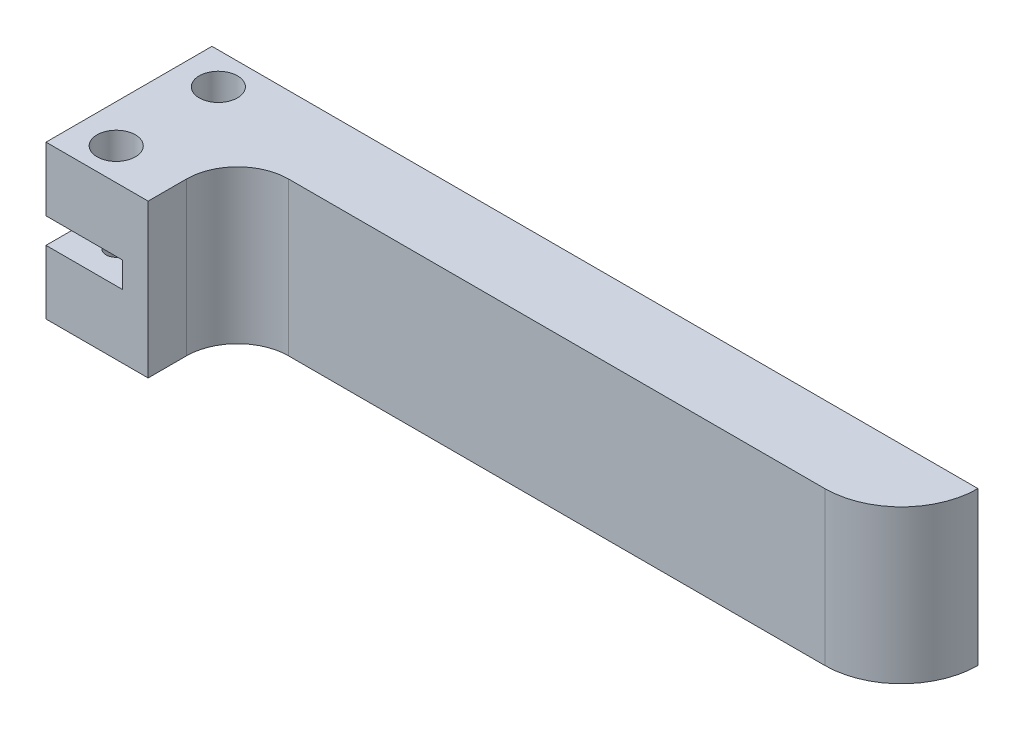
ISO-10303-21;
HEADER;
FILE_DESCRIPTION(('STEP AP214'),'2;1');
FILE_NAME('part.step','',(''),(''),'','','');
FILE_SCHEMA(('AUTOMOTIVE_DESIGN { 1 0 10303 214 1 1 1 1 }'));
ENDSEC;
DATA;
#1=APPLICATION_CONTEXT('core data for automotive mechanical design processes');
#2=APPLICATION_PROTOCOL_DEFINITION('international standard','automotive_design',2000,#1);
#3=PRODUCT_CONTEXT('',#1,'mechanical');
#4=PRODUCT('Part','Part','',(#3));
#5=PRODUCT_RELATED_PRODUCT_CATEGORY('part','',(#4));
#6=PRODUCT_DEFINITION_FORMATION('','',#4);
#7=PRODUCT_DEFINITION_CONTEXT('part definition',#1,'design');
#8=PRODUCT_DEFINITION('design','',#6,#7);
#9=PRODUCT_DEFINITION_SHAPE('','',#8);
#10=(LENGTH_UNIT() NAMED_UNIT(*) SI_UNIT(.MILLI.,.METRE.));
#11=(NAMED_UNIT(*) PLANE_ANGLE_UNIT() SI_UNIT($,.RADIAN.));
#12=(NAMED_UNIT(*) SI_UNIT($,.STERADIAN.) SOLID_ANGLE_UNIT());
#13=UNCERTAINTY_MEASURE_WITH_UNIT(LENGTH_MEASURE(1.E-05),#10,'distance_accuracy_value','');
#14=(GEOMETRIC_REPRESENTATION_CONTEXT(3) GLOBAL_UNCERTAINTY_ASSIGNED_CONTEXT((#13)) GLOBAL_UNIT_ASSIGNED_CONTEXT((#10,
#11,#12)) REPRESENTATION_CONTEXT('',''));
#15=CARTESIAN_POINT('',(0.,0.,0.));
#16=DIRECTION('',(0.,0.,1.));
#17=DIRECTION('',(1.,0.,0.));
#18=AXIS2_PLACEMENT_3D('',#15,#16,#17);
#19=CARTESIAN_POINT('',(-20.,6.,6.5));
#20=DIRECTION('',(1.,0.,0.));
#21=DIRECTION('',(0.,0.,-1.));
#22=AXIS2_PLACEMENT_3D('',#19,#20,#21);
#23=PLANE('',#22);
#24=DIRECTION('',(0.,-1.,0.));
#25=VECTOR('',#24,1.);
#26=CARTESIAN_POINT('',(-20.,6.,-6.5));
#27=LINE('',#26,#25);
#28=CARTESIAN_POINT('',(-20.,9.,-6.5));
#29=VERTEX_POINT('',#28);
#30=CARTESIAN_POINT('',(-20.,4.,-6.5));
#31=VERTEX_POINT('',#30);
#32=EDGE_CURVE('E130',#29,#31,#27,.T.);
#33=ORIENTED_EDGE('',*,*,#32,.T.);
#34=DIRECTION('',(0.,0.,1.));
#35=VECTOR('',#34,1.);
#36=CARTESIAN_POINT('',(-20.,4.,-6.5));
#37=LINE('',#36,#35);
#38=CARTESIAN_POINT('',(-20.,4.,6.5));
#39=VERTEX_POINT('',#38);
#40=EDGE_CURVE('E57',#31,#39,#37,.T.);
#41=ORIENTED_EDGE('',*,*,#40,.T.);
#42=DIRECTION('',(0.,-1.,0.));
#43=VECTOR('',#42,1.);
#44=CARTESIAN_POINT('',(-20.,6.,6.5));
#45=LINE('',#44,#43);
#46=CARTESIAN_POINT('',(-20.,9.,6.5));
#47=VERTEX_POINT('',#46);
#48=EDGE_CURVE('E226',#47,#39,#45,.T.);
#49=ORIENTED_EDGE('',*,*,#48,.F.);
#50=DIRECTION('',(0.,0.,1.));
#51=VECTOR('',#50,1.);
#52=CARTESIAN_POINT('',(-20.,9.,-6.5));
#53=LINE('',#52,#51);
#54=EDGE_CURVE('E183',#29,#47,#53,.T.);
#55=ORIENTED_EDGE('',*,*,#54,.F.);
#56=EDGE_LOOP('',(#33,#41,#49,#55));
#57=FACE_BOUND('',#56,.T.);
#58=ADVANCED_FACE('F33',(#57),#23,.F.);
#59=CARTESIAN_POINT('',(-20.,2.,6.5));
#60=VERTEX_POINT('',#59);
#61=CARTESIAN_POINT('',(-20.,-3.,6.5));
#62=VERTEX_POINT('',#61);
#63=EDGE_CURVE('E225',#60,#62,#45,.T.);
#64=ORIENTED_EDGE('',*,*,#63,.F.);
#65=DIRECTION('',(0.,0.,1.));
#66=VECTOR('',#65,1.);
#67=CARTESIAN_POINT('',(-20.,2.,-6.5));
#68=LINE('',#67,#66);
#69=CARTESIAN_POINT('',(-20.,2.,-6.5));
#70=VERTEX_POINT('',#69);
#71=EDGE_CURVE('E128',#70,#60,#68,.T.);
#72=ORIENTED_EDGE('',*,*,#71,.F.);
#73=CARTESIAN_POINT('',(-20.,-3.,-6.5));
#74=VERTEX_POINT('',#73);
#75=EDGE_CURVE('E122',#70,#74,#27,.T.);
#76=ORIENTED_EDGE('',*,*,#75,.T.);
#77=DIRECTION('',(0.,0.,-1.));
#78=VECTOR('',#77,1.);
#79=CARTESIAN_POINT('',(-20.,-3.,6.5));
#80=LINE('',#79,#78);
#81=EDGE_CURVE('E127',#62,#74,#80,.T.);
#82=ORIENTED_EDGE('',*,*,#81,.F.);
#83=EDGE_LOOP('',(#64,#72,#76,#82));
#84=FACE_BOUND('',#83,.T.);
#85=ADVANCED_FACE('F125',(#84),#23,.F.);
#86=CARTESIAN_POINT('',(20.,6.,6.5));
#87=DIRECTION('',(0.,0.,-1.));
#88=DIRECTION('',(-1.,0.,0.));
#89=AXIS2_PLACEMENT_3D('',#86,#87,#88);
#90=PLANE('',#89);
#91=ORIENTED_EDGE('',*,*,#63,.T.);
#92=DIRECTION('',(-1.,0.,0.));
#93=VECTOR('',#92,1.);
#94=CARTESIAN_POINT('',(-12.,-3.,6.5));
#95=LINE('',#94,#93);
#96=CARTESIAN_POINT('',(-12.,-3.,6.5));
#97=VERTEX_POINT('',#96);
#98=EDGE_CURVE('E147',#97,#62,#95,.T.);
#99=ORIENTED_EDGE('',*,*,#98,.F.);
#100=DIRECTION('',(0.,1.,0.));
#101=VECTOR('',#100,1.);
#102=CARTESIAN_POINT('',(-12.,0.,6.5));
#103=LINE('',#102,#101);
#104=CARTESIAN_POINT('',(-12.,9.,6.5));
#105=VERTEX_POINT('',#104);
#106=EDGE_CURVE('E199',#97,#105,#103,.T.);
#107=ORIENTED_EDGE('',*,*,#106,.T.);
#108=DIRECTION('',(1.,0.,0.));
#109=VECTOR('',#108,1.);
#110=CARTESIAN_POINT('',(-20.,9.,6.5));
#111=LINE('',#110,#109);
#112=EDGE_CURVE('E186',#47,#105,#111,.T.);
#113=ORIENTED_EDGE('',*,*,#112,.F.);
#114=ORIENTED_EDGE('',*,*,#48,.T.);
#115=DIRECTION('',(-1.,0.,0.));
#116=VECTOR('',#115,1.);
#117=CARTESIAN_POINT('',(-20.,4.,6.5));
#118=LINE('',#117,#116);
#119=CARTESIAN_POINT('',(-14.,4.,6.5));
#120=VERTEX_POINT('',#119);
#121=EDGE_CURVE('E73',#120,#39,#118,.T.);
#122=ORIENTED_EDGE('',*,*,#121,.F.);
#123=DIRECTION('',(0.,1.,0.));
#124=VECTOR('',#123,1.);
#125=CARTESIAN_POINT('',(-14.,4.,6.5));
#126=LINE('',#125,#124);
#127=CARTESIAN_POINT('',(-14.,2.,6.5));
#128=VERTEX_POINT('',#127);
#129=EDGE_CURVE('E214',#128,#120,#126,.T.);
#130=ORIENTED_EDGE('',*,*,#129,.F.);
#131=DIRECTION('',(1.,0.,0.));
#132=VECTOR('',#131,1.);
#133=CARTESIAN_POINT('',(-20.,2.,6.5));
#134=LINE('',#133,#132);
#135=EDGE_CURVE('E207',#60,#128,#134,.T.);
#136=ORIENTED_EDGE('',*,*,#135,.F.);
#137=EDGE_LOOP('',(#91,#99,#107,#113,#114,#122,#130,#136));
#138=FACE_BOUND('',#137,.T.);
#139=ADVANCED_FACE('F248',(#138),#90,.F.);
#140=CARTESIAN_POINT('',(20.,6.,-6.5));
#141=DIRECTION('',(0.,0.,1.));
#142=DIRECTION('',(1.,0.,0.));
#143=AXIS2_PLACEMENT_3D('',#140,#141,#142);
#144=PLANE('',#143);
#145=DIRECTION('',(0.,1.,0.));
#146=VECTOR('',#145,1.);
#147=CARTESIAN_POINT('',(-14.,4.,-6.5));
#148=LINE('',#147,#146);
#149=CARTESIAN_POINT('',(-14.,2.,-6.5));
#150=VERTEX_POINT('',#149);
#151=CARTESIAN_POINT('',(-14.,4.,-6.5));
#152=VERTEX_POINT('',#151);
#153=EDGE_CURVE('E48',#150,#152,#148,.T.);
#154=ORIENTED_EDGE('',*,*,#153,.T.);
#155=DIRECTION('',(-1.,0.,0.));
#156=VECTOR('',#155,1.);
#157=CARTESIAN_POINT('',(-20.,4.,-6.5));
#158=LINE('',#157,#156);
#159=EDGE_CURVE('E210',#152,#31,#158,.T.);
#160=ORIENTED_EDGE('',*,*,#159,.T.);
#161=ORIENTED_EDGE('',*,*,#32,.F.);
#162=DIRECTION('',(-1.,0.,0.));
#163=VECTOR('',#162,1.);
#164=CARTESIAN_POINT('',(40.,9.,-6.50000000000001));
#165=LINE('',#164,#163);
#166=CARTESIAN_POINT('',(40.,9.,-6.50000000000001));
#167=VERTEX_POINT('',#166);
#168=EDGE_CURVE('E180',#167,#29,#165,.T.);
#169=ORIENTED_EDGE('',*,*,#168,.F.);
#170=DIRECTION('',(0.,1.,0.));
#171=VECTOR('',#170,1.);
#172=CARTESIAN_POINT('',(40.,0.,-6.5));
#173=LINE('',#172,#171);
#174=CARTESIAN_POINT('',(40.,-3.,-6.5));
#175=VERTEX_POINT('',#174);
#176=EDGE_CURVE('E136',#175,#167,#173,.T.);
#177=ORIENTED_EDGE('',*,*,#176,.F.);
#178=DIRECTION('',(1.,0.,0.));
#179=VECTOR('',#178,1.);
#180=CARTESIAN_POINT('',(-20.,-3.,-6.5));
#181=LINE('',#180,#179);
#182=EDGE_CURVE('E133',#74,#175,#181,.T.);
#183=ORIENTED_EDGE('',*,*,#182,.F.);
#184=ORIENTED_EDGE('',*,*,#75,.F.);
#185=DIRECTION('',(1.,0.,0.));
#186=VECTOR('',#185,1.);
#187=CARTESIAN_POINT('',(-20.,2.,-6.5));
#188=LINE('',#187,#186);
#189=EDGE_CURVE('E77',#70,#150,#188,.T.);
#190=ORIENTED_EDGE('',*,*,#189,.T.);
#191=EDGE_LOOP('',(#154,#160,#161,#169,#177,#183,#184,#190));
#192=FACE_BOUND('',#191,.T.);
#193=ADVANCED_FACE('F134',(#192),#144,.F.);
#194=CARTESIAN_POINT('',(-20.,4.,-6.5));
#195=DIRECTION('',(0.,1.,0.));
#196=DIRECTION('',(-1.,0.,0.));
#197=AXIS2_PLACEMENT_3D('',#194,#195,#196);
#198=PLANE('',#197);
#199=CARTESIAN_POINT('',(-17.,4.,4.));
#200=DIRECTION('',(0.,1.,0.));
#201=DIRECTION('',(0.,0.,1.));
#202=AXIS2_PLACEMENT_3D('',#199,#200,#201);
#203=CIRCLE('',#202,1.5);
#204=CARTESIAN_POINT('',(-17.,4.,5.5));
#205=VERTEX_POINT('',#204);
#206=EDGE_CURVE('E201',#205,#205,#203,.T.);
#207=ORIENTED_EDGE('',*,*,#206,.T.);
#208=EDGE_LOOP('',(#207));
#209=FACE_BOUND('',#208,.T.);
#210=CARTESIAN_POINT('',(-17.,4.,-4.));
#211=DIRECTION('',(0.,1.,0.));
#212=DIRECTION('',(0.,0.,1.));
#213=AXIS2_PLACEMENT_3D('',#210,#211,#212);
#214=CIRCLE('',#213,1.5);
#215=CARTESIAN_POINT('',(-17.,4.,-2.5));
#216=VERTEX_POINT('',#215);
#217=EDGE_CURVE('E204',#216,#216,#214,.T.);
#218=ORIENTED_EDGE('',*,*,#217,.T.);
#219=EDGE_LOOP('',(#218));
#220=FACE_BOUND('',#219,.T.);
#221=ORIENTED_EDGE('',*,*,#121,.T.);
#222=ORIENTED_EDGE('',*,*,#40,.F.);
#223=ORIENTED_EDGE('',*,*,#159,.F.);
#224=DIRECTION('',(0.,0.,1.));
#225=VECTOR('',#224,1.);
#226=CARTESIAN_POINT('',(-14.,4.,-6.5));
#227=LINE('',#226,#225);
#228=EDGE_CURVE('E219',#152,#120,#227,.T.);
#229=ORIENTED_EDGE('',*,*,#228,.T.);
#230=EDGE_LOOP('',(#221,#222,#223,#229));
#231=FACE_BOUND('',#230,.T.);
#232=ADVANCED_FACE('F283',(#209,#220,#231),#198,.F.);
#233=CARTESIAN_POINT('',(-14.,4.,-6.5));
#234=DIRECTION('',(1.,0.,0.));
#235=DIRECTION('',(0.,0.,-1.));
#236=AXIS2_PLACEMENT_3D('',#233,#234,#235);
#237=PLANE('',#236);
#238=ORIENTED_EDGE('',*,*,#129,.T.);
#239=ORIENTED_EDGE('',*,*,#228,.F.);
#240=ORIENTED_EDGE('',*,*,#153,.F.);
#241=DIRECTION('',(0.,0.,1.));
#242=VECTOR('',#241,1.);
#243=CARTESIAN_POINT('',(-14.,2.,-6.5));
#244=LINE('',#243,#242);
#245=EDGE_CURVE('E221',#150,#128,#244,.T.);
#246=ORIENTED_EDGE('',*,*,#245,.T.);
#247=EDGE_LOOP('',(#238,#239,#240,#246));
#248=FACE_BOUND('',#247,.T.);
#249=ADVANCED_FACE('F286',(#248),#237,.F.);
#250=CARTESIAN_POINT('',(-20.,2.,-6.5));
#251=DIRECTION('',(0.,-1.,0.));
#252=DIRECTION('',(0.,0.,-1.));
#253=AXIS2_PLACEMENT_3D('',#250,#251,#252);
#254=PLANE('',#253);
#255=CARTESIAN_POINT('',(-17.,2.,4.));
#256=DIRECTION('',(0.,1.,0.));
#257=DIRECTION('',(0.,0.,1.));
#258=AXIS2_PLACEMENT_3D('',#255,#256,#257);
#259=CIRCLE('',#258,0.799999999999999);
#260=CARTESIAN_POINT('',(-17.,2.,4.8));
#261=VERTEX_POINT('',#260);
#262=EDGE_CURVE('E193',#261,#261,#259,.T.);
#263=ORIENTED_EDGE('',*,*,#262,.F.);
#264=EDGE_LOOP('',(#263));
#265=FACE_BOUND('',#264,.T.);
#266=CARTESIAN_POINT('',(-17.,2.,-4.));
#267=DIRECTION('',(0.,1.,0.));
#268=DIRECTION('',(0.,0.,1.));
#269=AXIS2_PLACEMENT_3D('',#266,#267,#268);
#270=CIRCLE('',#269,0.799999999999999);
#271=CARTESIAN_POINT('',(-17.,2.,-3.2));
#272=VERTEX_POINT('',#271);
#273=EDGE_CURVE('E196',#272,#272,#270,.T.);
#274=ORIENTED_EDGE('',*,*,#273,.F.);
#275=EDGE_LOOP('',(#274));
#276=FACE_BOUND('',#275,.T.);
#277=ORIENTED_EDGE('',*,*,#135,.T.);
#278=ORIENTED_EDGE('',*,*,#245,.F.);
#279=ORIENTED_EDGE('',*,*,#189,.F.);
#280=ORIENTED_EDGE('',*,*,#71,.T.);
#281=EDGE_LOOP('',(#277,#278,#279,#280));
#282=FACE_BOUND('',#281,.T.);
#283=ADVANCED_FACE('F251',(#265,#276,#282),#254,.F.);
#284=CARTESIAN_POINT('',(-17.,4.,-4.));
#285=DIRECTION('',(0.,1.,0.));
#286=DIRECTION('',(0.,0.,1.));
#287=AXIS2_PLACEMENT_3D('',#284,#285,#286);
#288=CYLINDRICAL_SURFACE('',#287,1.5);
#289=ORIENTED_EDGE('',*,*,#217,.F.);
#290=EDGE_LOOP('',(#289));
#291=FACE_BOUND('',#290,.T.);
#292=CARTESIAN_POINT('',(-17.,9.,-4.));
#293=DIRECTION('',(0.,1.,0.));
#294=DIRECTION('',(0.,0.,1.));
#295=AXIS2_PLACEMENT_3D('',#292,#293,#294);
#296=CIRCLE('',#295,1.5);
#297=CARTESIAN_POINT('',(-17.,9.,-2.5));
#298=VERTEX_POINT('',#297);
#299=EDGE_CURVE('E168',#298,#298,#296,.T.);
#300=ORIENTED_EDGE('',*,*,#299,.T.);
#301=EDGE_LOOP('',(#300));
#302=FACE_BOUND('',#301,.T.);
#303=ADVANCED_FACE('F278',(#291,#302),#288,.F.);
#304=CARTESIAN_POINT('',(-17.,4.,4.));
#305=DIRECTION('',(0.,1.,0.));
#306=DIRECTION('',(0.,0.,1.));
#307=AXIS2_PLACEMENT_3D('',#304,#305,#306);
#308=CYLINDRICAL_SURFACE('',#307,1.5);
#309=ORIENTED_EDGE('',*,*,#206,.F.);
#310=EDGE_LOOP('',(#309));
#311=FACE_BOUND('',#310,.T.);
#312=CARTESIAN_POINT('',(-17.,9.,4.));
#313=DIRECTION('',(0.,1.,0.));
#314=DIRECTION('',(0.,0.,1.));
#315=AXIS2_PLACEMENT_3D('',#312,#313,#314);
#316=CIRCLE('',#315,1.5);
#317=CARTESIAN_POINT('',(-17.,9.,5.5));
#318=VERTEX_POINT('',#317);
#319=EDGE_CURVE('E165',#318,#318,#316,.T.);
#320=ORIENTED_EDGE('',*,*,#319,.T.);
#321=EDGE_LOOP('',(#320));
#322=FACE_BOUND('',#321,.T.);
#323=ADVANCED_FACE('F273',(#311,#322),#308,.F.);
#324=CARTESIAN_POINT('',(-12.,0.,6.5));
#325=DIRECTION('',(-1.,0.,0.));
#326=DIRECTION('',(0.,0.,1.));
#327=AXIS2_PLACEMENT_3D('',#324,#325,#326);
#328=PLANE('',#327);
#329=ORIENTED_EDGE('',*,*,#106,.F.);
#330=DIRECTION('',(0.,0.,1.));
#331=VECTOR('',#330,1.);
#332=CARTESIAN_POINT('',(-12.,-3.,3.5));
#333=LINE('',#332,#331);
#334=CARTESIAN_POINT('',(-12.,-3.,3.5));
#335=VERTEX_POINT('',#334);
#336=EDGE_CURVE('E162',#335,#97,#333,.T.);
#337=ORIENTED_EDGE('',*,*,#336,.F.);
#338=DIRECTION('',(0.,1.,0.));
#339=VECTOR('',#338,1.);
#340=CARTESIAN_POINT('',(-12.,6.,3.5));
#341=LINE('',#340,#339);
#342=CARTESIAN_POINT('',(-12.,9.,3.5));
#343=VERTEX_POINT('',#342);
#344=EDGE_CURVE('E229',#335,#343,#341,.T.);
#345=ORIENTED_EDGE('',*,*,#344,.T.);
#346=DIRECTION('',(0.,0.,-1.));
#347=VECTOR('',#346,1.);
#348=CARTESIAN_POINT('',(-12.,9.,6.5));
#349=LINE('',#348,#347);
#350=EDGE_CURVE('E189',#105,#343,#349,.T.);
#351=ORIENTED_EDGE('',*,*,#350,.F.);
#352=EDGE_LOOP('',(#329,#337,#345,#351));
#353=FACE_BOUND('',#352,.T.);
#354=ADVANCED_FACE('F241',(#353),#328,.F.);
#355=CARTESIAN_POINT('',(20.,0.,-0.500000000000003));
#356=DIRECTION('',(0.,0.,-1.));
#357=DIRECTION('',(-1.,0.,0.));
#358=AXIS2_PLACEMENT_3D('',#355,#356,#357);
#359=PLANE('',#358);
#360=DIRECTION('',(0.,1.,0.));
#361=VECTOR('',#360,1.);
#362=CARTESIAN_POINT('',(-8.,0.,-0.5));
#363=LINE('',#362,#361);
#364=CARTESIAN_POINT('',(-8.,9.,-0.5));
#365=VERTEX_POINT('',#364);
#366=CARTESIAN_POINT('',(-8.,-3.,-0.5));
#367=VERTEX_POINT('',#366);
#368=EDGE_CURVE('E41',#365,#367,#363,.F.);
#369=ORIENTED_EDGE('',*,*,#368,.T.);
#370=DIRECTION('',(-1.,0.,0.));
#371=VECTOR('',#370,1.);
#372=CARTESIAN_POINT('',(34.,-3.,-0.500000000000006));
#373=LINE('',#372,#371);
#374=CARTESIAN_POINT('',(34.,-3.,-0.500000000000007));
#375=VERTEX_POINT('',#374);
#376=EDGE_CURVE('E156',#375,#367,#373,.T.);
#377=ORIENTED_EDGE('',*,*,#376,.F.);
#378=DIRECTION('',(0.,-1.,0.));
#379=VECTOR('',#378,1.);
#380=CARTESIAN_POINT('',(34.,6.,-0.500000000000005));
#381=LINE('',#380,#379);
#382=CARTESIAN_POINT('',(34.,9.,-0.500000000000005));
#383=VERTEX_POINT('',#382);
#384=EDGE_CURVE('E11',#375,#383,#381,.F.);
#385=ORIENTED_EDGE('',*,*,#384,.T.);
#386=DIRECTION('',(1.,0.,0.));
#387=VECTOR('',#386,1.);
#388=CARTESIAN_POINT('',(-8.,9.,-0.5));
#389=LINE('',#388,#387);
#390=EDGE_CURVE('E174',#365,#383,#389,.T.);
#391=ORIENTED_EDGE('',*,*,#390,.F.);
#392=EDGE_LOOP('',(#369,#377,#385,#391));
#393=FACE_BOUND('',#392,.T.);
#394=ADVANCED_FACE('F233',(#393),#359,.F.);
#395=CARTESIAN_POINT('',(-8.,0.,3.5));
#396=DIRECTION('',(0.,-1.,0.));
#397=DIRECTION('',(0.,0.,-1.));
#398=AXIS2_PLACEMENT_3D('',#395,#396,#397);
#399=CYLINDRICAL_SURFACE('',#398,4.);
#400=ORIENTED_EDGE('',*,*,#344,.F.);
#401=CARTESIAN_POINT('',(-8.,-3.,3.5));
#402=DIRECTION('',(0.,1.,0.));
#403=DIRECTION('',(0.,0.,-1.));
#404=AXIS2_PLACEMENT_3D('',#401,#402,#403);
#405=CIRCLE('',#404,4.);
#406=EDGE_CURVE('E159',#367,#335,#405,.T.);
#407=ORIENTED_EDGE('',*,*,#406,.F.);
#408=ORIENTED_EDGE('',*,*,#368,.F.);
#409=CARTESIAN_POINT('',(-8.,9.,3.5));
#410=DIRECTION('',(0.,-1.,0.));
#411=DIRECTION('',(0.,0.,1.));
#412=AXIS2_PLACEMENT_3D('',#409,#410,#411);
#413=CIRCLE('',#412,4.);
#414=EDGE_CURVE('E171',#343,#365,#413,.T.);
#415=ORIENTED_EDGE('',*,*,#414,.F.);
#416=EDGE_LOOP('',(#400,#407,#408,#415));
#417=FACE_BOUND('',#416,.T.);
#418=ADVANCED_FACE('F238',(#417),#399,.F.);
#419=CARTESIAN_POINT('',(-17.,0.,-4.));
#420=DIRECTION('',(0.,1.,0.));
#421=DIRECTION('',(0.,0.,1.));
#422=AXIS2_PLACEMENT_3D('',#419,#420,#421);
#423=CYLINDRICAL_SURFACE('',#422,0.799999999999999);
#424=ORIENTED_EDGE('',*,*,#273,.T.);
#425=EDGE_LOOP('',(#424));
#426=FACE_BOUND('',#425,.T.);
#427=CARTESIAN_POINT('',(-17.,-3.,-4.));
#428=DIRECTION('',(0.,-1.,0.));
#429=DIRECTION('',(0.,0.,-1.));
#430=AXIS2_PLACEMENT_3D('',#427,#428,#429);
#431=CIRCLE('',#430,0.799999999999999);
#432=CARTESIAN_POINT('',(-17.,-3.,-4.8));
#433=VERTEX_POINT('',#432);
#434=EDGE_CURVE('E151',#433,#433,#431,.T.);
#435=ORIENTED_EDGE('',*,*,#434,.T.);
#436=EDGE_LOOP('',(#435));
#437=FACE_BOUND('',#436,.T.);
#438=ADVANCED_FACE('F261',(#426,#437),#423,.F.);
#439=CARTESIAN_POINT('',(-17.,0.,4.));
#440=DIRECTION('',(0.,1.,0.));
#441=DIRECTION('',(0.,0.,1.));
#442=AXIS2_PLACEMENT_3D('',#439,#440,#441);
#443=CYLINDRICAL_SURFACE('',#442,0.799999999999999);
#444=ORIENTED_EDGE('',*,*,#262,.T.);
#445=EDGE_LOOP('',(#444));
#446=FACE_BOUND('',#445,.T.);
#447=CARTESIAN_POINT('',(-17.,-3.,4.));
#448=DIRECTION('',(0.,-1.,0.));
#449=DIRECTION('',(0.,0.,-1.));
#450=AXIS2_PLACEMENT_3D('',#447,#448,#449);
#451=CIRCLE('',#450,0.799999999999999);
#452=CARTESIAN_POINT('',(-17.,-3.,3.2));
#453=VERTEX_POINT('',#452);
#454=EDGE_CURVE('E148',#453,#453,#451,.T.);
#455=ORIENTED_EDGE('',*,*,#454,.T.);
#456=EDGE_LOOP('',(#455));
#457=FACE_BOUND('',#456,.T.);
#458=ADVANCED_FACE('F266',(#446,#457),#443,.F.);
#459=CARTESIAN_POINT('',(34.,0.,-6.50000000000001));
#460=DIRECTION('',(0.,1.,0.));
#461=DIRECTION('',(0.,0.,1.));
#462=AXIS2_PLACEMENT_3D('',#459,#460,#461);
#463=CYLINDRICAL_SURFACE('',#462,6.);
#464=ORIENTED_EDGE('',*,*,#176,.T.);
#465=CARTESIAN_POINT('',(34.,9.,-6.50000000000001));
#466=DIRECTION('',(0.,1.,0.));
#467=DIRECTION('',(0.,0.,1.));
#468=AXIS2_PLACEMENT_3D('',#465,#466,#467);
#469=CIRCLE('',#468,6.);
#470=EDGE_CURVE('E177',#383,#167,#469,.T.);
#471=ORIENTED_EDGE('',*,*,#470,.F.);
#472=ORIENTED_EDGE('',*,*,#384,.F.);
#473=CARTESIAN_POINT('',(34.,-3.,-6.50000000000001));
#474=DIRECTION('',(0.,-1.,0.));
#475=DIRECTION('',(0.,0.,-1.));
#476=AXIS2_PLACEMENT_3D('',#473,#474,#475);
#477=CIRCLE('',#476,6.);
#478=EDGE_CURVE('E140',#175,#375,#477,.T.);
#479=ORIENTED_EDGE('',*,*,#478,.F.);
#480=EDGE_LOOP('',(#464,#471,#472,#479));
#481=FACE_BOUND('',#480,.T.);
#482=ADVANCED_FACE('F35',(#481),#463,.T.);
#483=CARTESIAN_POINT('',(-8.,9.,3.5));
#484=DIRECTION('',(0.,1.,0.));
#485=DIRECTION('',(0.,0.,1.));
#486=AXIS2_PLACEMENT_3D('',#483,#484,#485);
#487=PLANE('',#486);
#488=ORIENTED_EDGE('',*,*,#299,.F.);
#489=EDGE_LOOP('',(#488));
#490=FACE_BOUND('',#489,.T.);
#491=ORIENTED_EDGE('',*,*,#414,.T.);
#492=ORIENTED_EDGE('',*,*,#390,.T.);
#493=ORIENTED_EDGE('',*,*,#470,.T.);
#494=ORIENTED_EDGE('',*,*,#168,.T.);
#495=ORIENTED_EDGE('',*,*,#54,.T.);
#496=ORIENTED_EDGE('',*,*,#112,.T.);
#497=ORIENTED_EDGE('',*,*,#350,.T.);
#498=EDGE_LOOP('',(#491,#492,#493,#494,#495,#496,#497));
#499=FACE_BOUND('',#498,.T.);
#500=ORIENTED_EDGE('',*,*,#319,.F.);
#501=EDGE_LOOP('',(#500));
#502=FACE_BOUND('',#501,.T.);
#503=ADVANCED_FACE('F243',(#490,#499,#502),#487,.T.);
#504=CARTESIAN_POINT('',(34.,-3.,-6.50000000000001));
#505=DIRECTION('',(0.,-1.,0.));
#506=DIRECTION('',(0.,0.,-1.));
#507=AXIS2_PLACEMENT_3D('',#504,#505,#506);
#508=PLANE('',#507);
#509=ORIENTED_EDGE('',*,*,#454,.F.);
#510=EDGE_LOOP('',(#509));
#511=FACE_BOUND('',#510,.T.);
#512=ORIENTED_EDGE('',*,*,#81,.T.);
#513=ORIENTED_EDGE('',*,*,#182,.T.);
#514=ORIENTED_EDGE('',*,*,#478,.T.);
#515=ORIENTED_EDGE('',*,*,#376,.T.);
#516=ORIENTED_EDGE('',*,*,#406,.T.);
#517=ORIENTED_EDGE('',*,*,#336,.T.);
#518=ORIENTED_EDGE('',*,*,#98,.T.);
#519=EDGE_LOOP('',(#512,#513,#514,#515,#516,#517,#518));
#520=FACE_BOUND('',#519,.T.);
#521=ORIENTED_EDGE('',*,*,#434,.F.);
#522=EDGE_LOOP('',(#521));
#523=FACE_BOUND('',#522,.T.);
#524=ADVANCED_FACE('F143',(#511,#520,#523),#508,.T.);
#525=CLOSED_SHELL('',(#58,#85,#139,#193,#232,#249,#283,#303,#323,#354,#394,#418,#438,#458,#482,
#503,#524));
#526=MANIFOLD_SOLID_BREP('B2',#525);
#527=ADVANCED_BREP_SHAPE_REPRESENTATION('',(#18,#526),#14);
#528=SHAPE_DEFINITION_REPRESENTATION(#9,#527);
ENDSEC;
END-ISO-10303-21;
